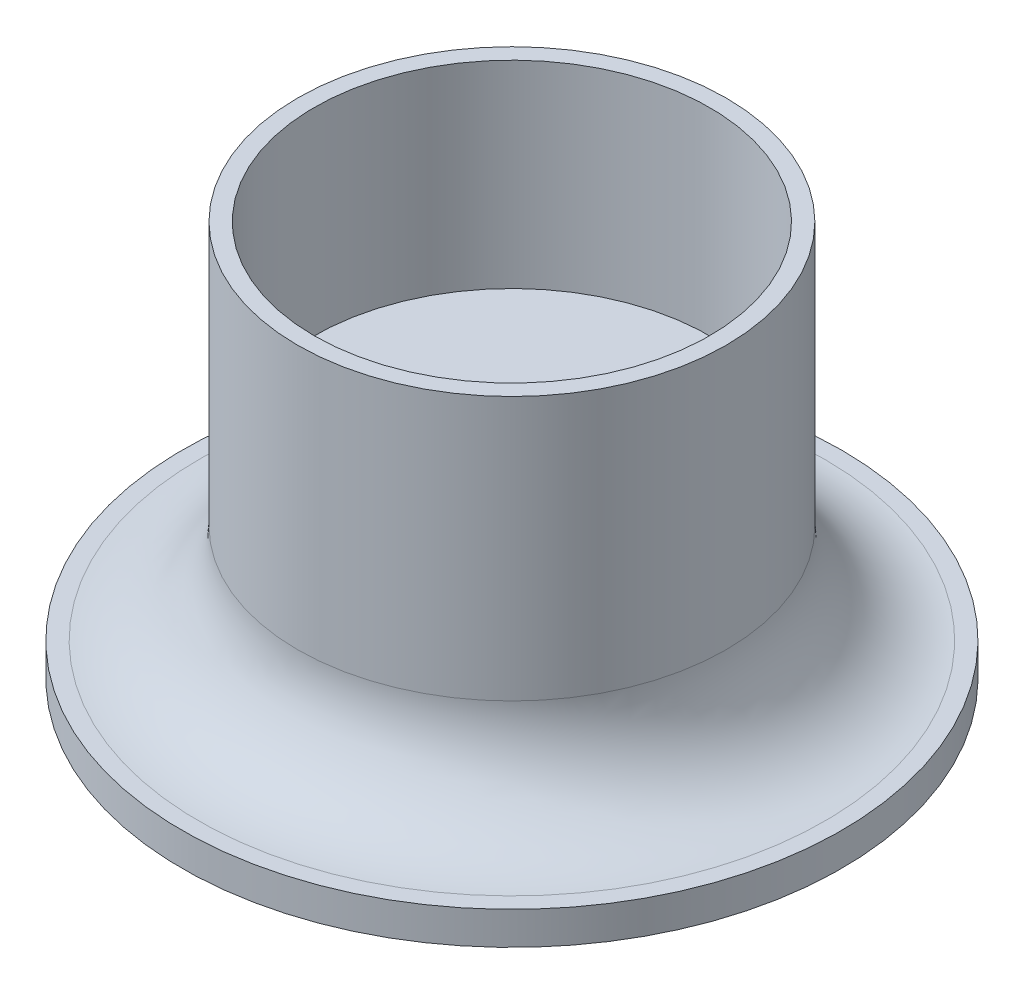
ISO-10303-21;
HEADER;
FILE_DESCRIPTION(('STEP AP214'),'2;1');
FILE_NAME('part.step','',(''),(''),'','','');
FILE_SCHEMA(('AUTOMOTIVE_DESIGN { 1 0 10303 214 1 1 1 1 }'));
ENDSEC;
DATA;
#1=APPLICATION_CONTEXT('core data for automotive mechanical design processes');
#2=APPLICATION_PROTOCOL_DEFINITION('international standard','automotive_design',2000,#1);
#3=PRODUCT_CONTEXT('',#1,'mechanical');
#4=PRODUCT('Part','Part','',(#3));
#5=PRODUCT_RELATED_PRODUCT_CATEGORY('part','',(#4));
#6=PRODUCT_DEFINITION_FORMATION('','',#4);
#7=PRODUCT_DEFINITION_CONTEXT('part definition',#1,'design');
#8=PRODUCT_DEFINITION('design','',#6,#7);
#9=PRODUCT_DEFINITION_SHAPE('','',#8);
#10=(LENGTH_UNIT() NAMED_UNIT(*) SI_UNIT(.MILLI.,.METRE.));
#11=(NAMED_UNIT(*) PLANE_ANGLE_UNIT() SI_UNIT($,.RADIAN.));
#12=(NAMED_UNIT(*) SI_UNIT($,.STERADIAN.) SOLID_ANGLE_UNIT());
#13=UNCERTAINTY_MEASURE_WITH_UNIT(LENGTH_MEASURE(1.E-05),#10,'distance_accuracy_value','');
#14=(GEOMETRIC_REPRESENTATION_CONTEXT(3) GLOBAL_UNCERTAINTY_ASSIGNED_CONTEXT((#13)) GLOBAL_UNIT_ASSIGNED_CONTEXT((#10,
#11,#12)) REPRESENTATION_CONTEXT('',''));
#15=CARTESIAN_POINT('',(0.,0.,0.));
#16=DIRECTION('',(0.,0.,1.));
#17=DIRECTION('',(1.,0.,0.));
#18=AXIS2_PLACEMENT_3D('',#15,#16,#17);
#19=CARTESIAN_POINT('',(0.,50.,0.));
#20=DIRECTION('',(0.,-1.,0.));
#21=DIRECTION('',(0.,0.,-1.));
#22=AXIS2_PLACEMENT_3D('',#19,#20,#21);
#23=CYLINDRICAL_SURFACE('',#22,65.);
#24=CARTESIAN_POINT('',(0.,30.,0.));
#25=DIRECTION('',(0.,-1.,0.));
#26=DIRECTION('',(0.,0.,-1.));
#27=AXIS2_PLACEMENT_3D('',#24,#25,#26);
#28=CIRCLE('',#27,65.);
#29=CARTESIAN_POINT('',(0.,30.,-65.));
#30=VERTEX_POINT('',#29);
#31=EDGE_CURVE('E40',#30,#30,#28,.F.);
#32=ORIENTED_EDGE('',*,*,#31,.T.);
#33=EDGE_LOOP('',(#32));
#34=FACE_BOUND('',#33,.T.);
#35=CARTESIAN_POINT('',(0.,110.,0.));
#36=DIRECTION('',(0.,1.,0.));
#37=DIRECTION('',(0.,0.,1.));
#38=AXIS2_PLACEMENT_3D('',#35,#36,#37);
#39=CIRCLE('',#38,65.);
#40=CARTESIAN_POINT('',(0.,110.,65.));
#41=VERTEX_POINT('',#40);
#42=EDGE_CURVE('E48',#41,#41,#39,.T.);
#43=ORIENTED_EDGE('',*,*,#42,.F.);
#44=EDGE_LOOP('',(#43));
#45=FACE_BOUND('',#44,.T.);
#46=ADVANCED_FACE('F33',(#34,#45),#23,.T.);
#47=CARTESIAN_POINT('',(0.,110.,0.));
#48=DIRECTION('',(0.,1.,0.));
#49=DIRECTION('',(0.,0.,1.));
#50=AXIS2_PLACEMENT_3D('',#47,#48,#49);
#51=PLANE('',#50);
#52=ORIENTED_EDGE('',*,*,#42,.T.);
#53=EDGE_LOOP('',(#52));
#54=FACE_BOUND('',#53,.T.);
#55=CARTESIAN_POINT('',(0.,110.,0.));
#56=DIRECTION('',(0.,1.,0.));
#57=DIRECTION('',(0.,0.,1.));
#58=AXIS2_PLACEMENT_3D('',#55,#56,#57);
#59=CIRCLE('',#58,60.);
#60=CARTESIAN_POINT('',(0.,110.,60.));
#61=VERTEX_POINT('',#60);
#62=EDGE_CURVE('E53',#61,#61,#59,.T.);
#63=ORIENTED_EDGE('',*,*,#62,.F.);
#64=EDGE_LOOP('',(#63));
#65=FACE_BOUND('',#64,.T.);
#66=ADVANCED_FACE('F82',(#54,#65),#51,.T.);
#67=CARTESIAN_POINT('',(0.,110.,0.));
#68=DIRECTION('',(0.,-1.,0.));
#69=DIRECTION('',(0.,0.,-1.));
#70=AXIS2_PLACEMENT_3D('',#67,#68,#69);
#71=CYLINDRICAL_SURFACE('',#70,60.);
#72=ORIENTED_EDGE('',*,*,#62,.T.);
#73=EDGE_LOOP('',(#72));
#74=FACE_BOUND('',#73,.T.);
#75=CARTESIAN_POINT('',(0.,50.,0.));
#76=DIRECTION('',(0.,1.,0.));
#77=DIRECTION('',(0.,0.,1.));
#78=AXIS2_PLACEMENT_3D('',#75,#76,#77);
#79=CIRCLE('',#78,60.);
#80=CARTESIAN_POINT('',(0.,50.,60.));
#81=VERTEX_POINT('',#80);
#82=EDGE_CURVE('E44',#81,#81,#79,.F.);
#83=ORIENTED_EDGE('',*,*,#82,.T.);
#84=EDGE_LOOP('',(#83));
#85=FACE_BOUND('',#84,.T.);
#86=ADVANCED_FACE('F86',(#74,#85),#71,.F.);
#87=CARTESIAN_POINT('',(0.,50.,0.));
#88=DIRECTION('',(0.,1.,0.));
#89=DIRECTION('',(0.,0.,1.));
#90=AXIS2_PLACEMENT_3D('',#87,#88,#89);
#91=PLANE('',#90);
#92=ORIENTED_EDGE('',*,*,#82,.F.);
#93=EDGE_LOOP('',(#92));
#94=FACE_BOUND('',#93,.T.);
#95=ADVANCED_FACE('F68',(#94),#91,.T.);
#96=CARTESIAN_POINT('',(0.,-10.,0.));
#97=DIRECTION('',(0.,1.,0.));
#98=DIRECTION('',(0.,0.,1.));
#99=AXIS2_PLACEMENT_3D('',#96,#97,#98);
#100=CYLINDRICAL_SURFACE('',#99,100.);
#101=CARTESIAN_POINT('',(0.,-10.,0.));
#102=DIRECTION('',(0.,-1.,0.));
#103=DIRECTION('',(0.,0.,-1.));
#104=AXIS2_PLACEMENT_3D('',#101,#102,#103);
#105=CIRCLE('',#104,100.);
#106=CARTESIAN_POINT('',(0.,-10.,-100.));
#107=VERTEX_POINT('',#106);
#108=EDGE_CURVE('E56',#107,#107,#105,.T.);
#109=ORIENTED_EDGE('',*,*,#108,.F.);
#110=EDGE_LOOP('',(#109));
#111=FACE_BOUND('',#110,.T.);
#112=CARTESIAN_POINT('',(0.,0.,0.));
#113=DIRECTION('',(0.,-1.,0.));
#114=DIRECTION('',(0.,0.,-1.));
#115=AXIS2_PLACEMENT_3D('',#112,#113,#114);
#116=CIRCLE('',#115,100.);
#117=CARTESIAN_POINT('',(0.,0.,-100.));
#118=VERTEX_POINT('',#117);
#119=EDGE_CURVE('E57',#118,#118,#116,.T.);
#120=ORIENTED_EDGE('',*,*,#119,.T.);
#121=EDGE_LOOP('',(#120));
#122=FACE_BOUND('',#121,.T.);
#123=ADVANCED_FACE('F65',(#111,#122),#100,.T.);
#124=CARTESIAN_POINT('',(0.,-10.,0.));
#125=DIRECTION('',(0.,-1.,0.));
#126=DIRECTION('',(0.,0.,-1.));
#127=AXIS2_PLACEMENT_3D('',#124,#125,#126);
#128=PLANE('',#127);
#129=ORIENTED_EDGE('',*,*,#108,.T.);
#130=EDGE_LOOP('',(#129));
#131=FACE_BOUND('',#130,.T.);
#132=ADVANCED_FACE('F63',(#131),#128,.T.);
#133=CARTESIAN_POINT('',(0.,0.,0.));
#134=DIRECTION('',(0.,-1.,0.));
#135=DIRECTION('',(0.,0.,-1.));
#136=AXIS2_PLACEMENT_3D('',#133,#134,#135);
#137=PLANE('',#136);
#138=CARTESIAN_POINT('',(0.,0.,0.));
#139=DIRECTION('',(0.,-1.,0.));
#140=DIRECTION('',(0.,0.,-1.));
#141=AXIS2_PLACEMENT_3D('',#138,#139,#140);
#142=CIRCLE('',#141,95.);
#143=CARTESIAN_POINT('',(0.,0.,-95.));
#144=VERTEX_POINT('',#143);
#145=EDGE_CURVE('E10',#144,#144,#142,.T.);
#146=ORIENTED_EDGE('',*,*,#145,.T.);
#147=EDGE_LOOP('',(#146));
#148=FACE_BOUND('',#147,.T.);
#149=ORIENTED_EDGE('',*,*,#119,.F.);
#150=EDGE_LOOP('',(#149));
#151=FACE_BOUND('',#150,.T.);
#152=ADVANCED_FACE('F72',(#148,#151),#137,.F.);
#153=CARTESIAN_POINT('',(0.,30.,0.));
#154=DIRECTION('',(0.,-1.,0.));
#155=DIRECTION('',(0.,0.,-1.));
#156=AXIS2_PLACEMENT_3D('',#153,#154,#155);
#157=TOROIDAL_SURFACE('',#156,95.,30.);
#158=ORIENTED_EDGE('',*,*,#145,.F.);
#159=EDGE_LOOP('',(#158));
#160=FACE_BOUND('',#159,.T.);
#161=ORIENTED_EDGE('',*,*,#31,.F.);
#162=EDGE_LOOP('',(#161));
#163=FACE_BOUND('',#162,.T.);
#164=ADVANCED_FACE('F35',(#160,#163),#157,.F.);
#165=CLOSED_SHELL('',(#46,#66,#86,#95,#123,#132,#152,#164));
#166=MANIFOLD_SOLID_BREP('B2',#165);
#167=ADVANCED_BREP_SHAPE_REPRESENTATION('',(#18,#166),#14);
#168=SHAPE_DEFINITION_REPRESENTATION(#9,#167);
ENDSEC;
END-ISO-10303-21;
